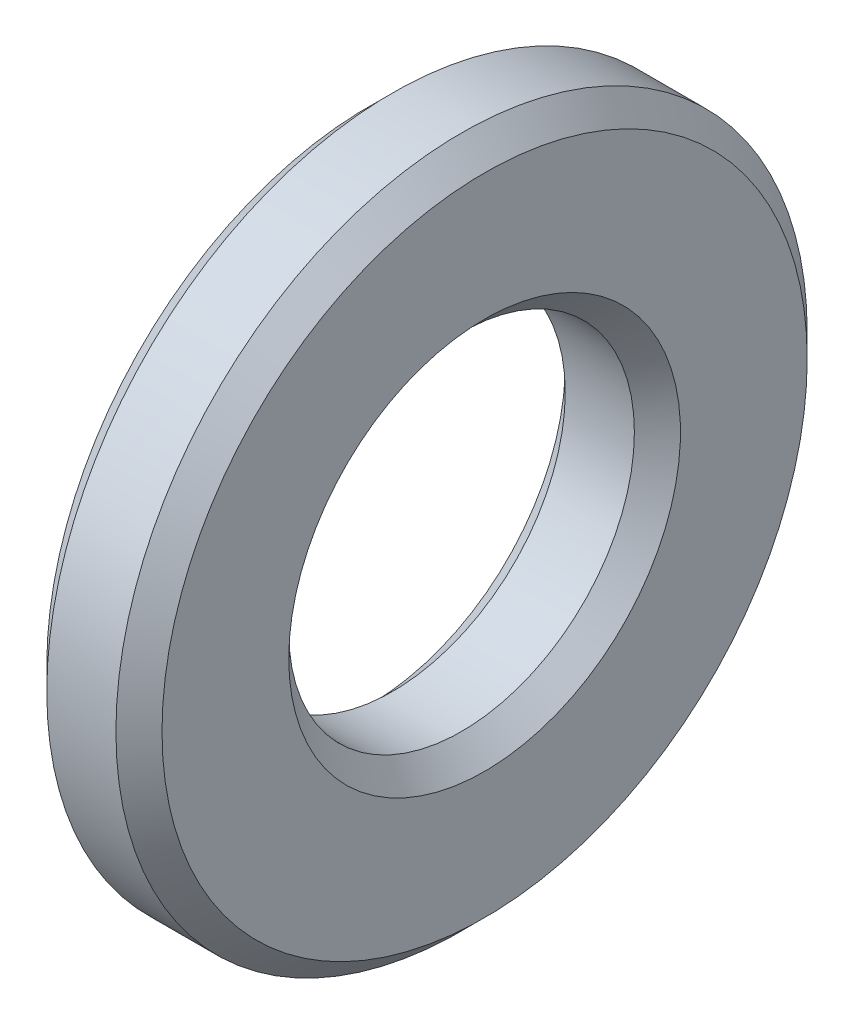
ISO-10303-21;
HEADER;
FILE_DESCRIPTION(('STEP AP214'),'2;1');
FILE_NAME('part.step','',(''),(''),'','','');
FILE_SCHEMA(('AUTOMOTIVE_DESIGN { 1 0 10303 214 1 1 1 1 }'));
ENDSEC;
DATA;
#1=APPLICATION_CONTEXT('core data for automotive mechanical design processes');
#2=APPLICATION_PROTOCOL_DEFINITION('international standard','automotive_design',2000,#1);
#3=PRODUCT_CONTEXT('',#1,'mechanical');
#4=PRODUCT('Part','Part','',(#3));
#5=PRODUCT_RELATED_PRODUCT_CATEGORY('part','',(#4));
#6=PRODUCT_DEFINITION_FORMATION('','',#4);
#7=PRODUCT_DEFINITION_CONTEXT('part definition',#1,'design');
#8=PRODUCT_DEFINITION('design','',#6,#7);
#9=PRODUCT_DEFINITION_SHAPE('','',#8);
#10=(LENGTH_UNIT() NAMED_UNIT(*) SI_UNIT(.MILLI.,.METRE.));
#11=(NAMED_UNIT(*) PLANE_ANGLE_UNIT() SI_UNIT($,.RADIAN.));
#12=(NAMED_UNIT(*) SI_UNIT($,.STERADIAN.) SOLID_ANGLE_UNIT());
#13=UNCERTAINTY_MEASURE_WITH_UNIT(LENGTH_MEASURE(1.E-05),#10,'distance_accuracy_value','');
#14=(GEOMETRIC_REPRESENTATION_CONTEXT(3) GLOBAL_UNCERTAINTY_ASSIGNED_CONTEXT((#13)) GLOBAL_UNIT_ASSIGNED_CONTEXT((#10,
#11,#12)) REPRESENTATION_CONTEXT('',''));
#15=CARTESIAN_POINT('',(0.,0.,0.));
#16=DIRECTION('',(0.,0.,1.));
#17=DIRECTION('',(1.,0.,0.));
#18=AXIS2_PLACEMENT_3D('',#15,#16,#17);
#19=CARTESIAN_POINT('',(0.2,0.,0.));
#20=DIRECTION('',(1.,0.,0.));
#21=DIRECTION('',(0.,0.,-1.));
#22=AXIS2_PLACEMENT_3D('',#19,#20,#21);
#23=CONICAL_SURFACE('',#22,3.,0.785398163397448);
#24=CARTESIAN_POINT('',(0.,0.,0.));
#25=DIRECTION('',(-1.,0.,0.));
#26=DIRECTION('',(0.,0.,1.));
#27=AXIS2_PLACEMENT_3D('',#24,#25,#26);
#28=CIRCLE('',#27,2.8);
#29=CARTESIAN_POINT('',(0.,0.,2.8));
#30=VERTEX_POINT('',#29);
#31=EDGE_CURVE('E10',#30,#30,#28,.T.);
#32=ORIENTED_EDGE('',*,*,#31,.F.);
#33=EDGE_LOOP('',(#32));
#34=FACE_BOUND('',#33,.T.);
#35=CARTESIAN_POINT('',(0.2,0.,0.));
#36=DIRECTION('',(-1.,0.,0.));
#37=DIRECTION('',(0.,0.,1.));
#38=AXIS2_PLACEMENT_3D('',#35,#36,#37);
#39=CIRCLE('',#38,3.);
#40=CARTESIAN_POINT('',(0.2,0.,3.));
#41=VERTEX_POINT('',#40);
#42=EDGE_CURVE('E67',#41,#41,#39,.T.);
#43=ORIENTED_EDGE('',*,*,#42,.T.);
#44=EDGE_LOOP('',(#43));
#45=FACE_BOUND('',#44,.T.);
#46=ADVANCED_FACE('F39',(#34,#45),#23,.T.);
#47=CARTESIAN_POINT('',(0.,2.8,0.));
#48=DIRECTION('',(1.,0.,0.));
#49=DIRECTION('',(0.,0.,-1.));
#50=AXIS2_PLACEMENT_3D('',#47,#48,#49);
#51=PLANE('',#50);
#52=CARTESIAN_POINT('',(0.,0.,0.));
#53=DIRECTION('',(-1.,0.,0.));
#54=DIRECTION('',(0.,0.,1.));
#55=AXIS2_PLACEMENT_3D('',#52,#53,#54);
#56=CIRCLE('',#55,1.7);
#57=CARTESIAN_POINT('',(0.,0.,1.7));
#58=VERTEX_POINT('',#57);
#59=EDGE_CURVE('E45',#58,#58,#56,.T.);
#60=ORIENTED_EDGE('',*,*,#59,.F.);
#61=EDGE_LOOP('',(#60));
#62=FACE_BOUND('',#61,.T.);
#63=ORIENTED_EDGE('',*,*,#31,.T.);
#64=EDGE_LOOP('',(#63));
#65=FACE_BOUND('',#64,.T.);
#66=ADVANCED_FACE('F104',(#62,#65),#51,.F.);
#67=CARTESIAN_POINT('',(0.,0.,0.));
#68=DIRECTION('',(-1.,0.,0.));
#69=DIRECTION('',(0.,0.,1.));
#70=AXIS2_PLACEMENT_3D('',#67,#68,#69);
#71=CONICAL_SURFACE('',#70,1.7,0.785398163397448);
#72=CARTESIAN_POINT('',(0.2,0.,0.));
#73=DIRECTION('',(-1.,0.,0.));
#74=DIRECTION('',(0.,0.,1.));
#75=AXIS2_PLACEMENT_3D('',#72,#73,#74);
#76=CIRCLE('',#75,1.5);
#77=CARTESIAN_POINT('',(0.2,0.,1.5));
#78=VERTEX_POINT('',#77);
#79=EDGE_CURVE('E49',#78,#78,#76,.T.);
#80=ORIENTED_EDGE('',*,*,#79,.F.);
#81=EDGE_LOOP('',(#80));
#82=FACE_BOUND('',#81,.T.);
#83=ORIENTED_EDGE('',*,*,#59,.T.);
#84=EDGE_LOOP('',(#83));
#85=FACE_BOUND('',#84,.T.);
#86=ADVANCED_FACE('F99',(#82,#85),#71,.F.);
#87=CARTESIAN_POINT('',(-0.05,0.,0.));
#88=DIRECTION('',(-1.,0.,0.));
#89=DIRECTION('',(0.,0.,1.));
#90=AXIS2_PLACEMENT_3D('',#87,#88,#89);
#91=CYLINDRICAL_SURFACE('',#90,1.5);
#92=CARTESIAN_POINT('',(0.8,0.,0.));
#93=DIRECTION('',(-1.,0.,0.));
#94=DIRECTION('',(0.,0.,1.));
#95=AXIS2_PLACEMENT_3D('',#92,#93,#94);
#96=CIRCLE('',#95,1.5);
#97=CARTESIAN_POINT('',(0.8,0.,1.5));
#98=VERTEX_POINT('',#97);
#99=EDGE_CURVE('E53',#98,#98,#96,.T.);
#100=ORIENTED_EDGE('',*,*,#99,.F.);
#101=EDGE_LOOP('',(#100));
#102=FACE_BOUND('',#101,.T.);
#103=ORIENTED_EDGE('',*,*,#79,.T.);
#104=EDGE_LOOP('',(#103));
#105=FACE_BOUND('',#104,.T.);
#106=ADVANCED_FACE('F93',(#102,#105),#91,.F.);
#107=CARTESIAN_POINT('',(0.8,0.,0.));
#108=DIRECTION('',(1.,0.,0.));
#109=DIRECTION('',(0.,0.,-1.));
#110=AXIS2_PLACEMENT_3D('',#107,#108,#109);
#111=CONICAL_SURFACE('',#110,1.5,0.785398163397449);
#112=CARTESIAN_POINT('',(1.,0.,0.));
#113=DIRECTION('',(-1.,0.,0.));
#114=DIRECTION('',(0.,0.,1.));
#115=AXIS2_PLACEMENT_3D('',#112,#113,#114);
#116=CIRCLE('',#115,1.7);
#117=CARTESIAN_POINT('',(1.,0.,1.7));
#118=VERTEX_POINT('',#117);
#119=EDGE_CURVE('E58',#118,#118,#116,.T.);
#120=ORIENTED_EDGE('',*,*,#119,.F.);
#121=EDGE_LOOP('',(#120));
#122=FACE_BOUND('',#121,.T.);
#123=ORIENTED_EDGE('',*,*,#99,.T.);
#124=EDGE_LOOP('',(#123));
#125=FACE_BOUND('',#124,.T.);
#126=ADVANCED_FACE('F87',(#122,#125),#111,.F.);
#127=CARTESIAN_POINT('',(1.,2.8,0.));
#128=DIRECTION('',(-1.,0.,0.));
#129=DIRECTION('',(0.,0.,1.));
#130=AXIS2_PLACEMENT_3D('',#127,#128,#129);
#131=PLANE('',#130);
#132=CARTESIAN_POINT('',(1.,0.,0.));
#133=DIRECTION('',(-1.,0.,0.));
#134=DIRECTION('',(0.,0.,1.));
#135=AXIS2_PLACEMENT_3D('',#132,#133,#134);
#136=CIRCLE('',#135,2.8);
#137=CARTESIAN_POINT('',(1.,0.,2.8));
#138=VERTEX_POINT('',#137);
#139=EDGE_CURVE('E61',#138,#138,#136,.T.);
#140=ORIENTED_EDGE('',*,*,#139,.F.);
#141=EDGE_LOOP('',(#140));
#142=FACE_BOUND('',#141,.T.);
#143=ORIENTED_EDGE('',*,*,#119,.T.);
#144=EDGE_LOOP('',(#143));
#145=FACE_BOUND('',#144,.T.);
#146=ADVANCED_FACE('F81',(#142,#145),#131,.F.);
#147=CARTESIAN_POINT('',(1.,0.,0.));
#148=DIRECTION('',(-1.,0.,0.));
#149=DIRECTION('',(0.,0.,1.));
#150=AXIS2_PLACEMENT_3D('',#147,#148,#149);
#151=CONICAL_SURFACE('',#150,2.8,0.785398163397449);
#152=CARTESIAN_POINT('',(0.8,0.,0.));
#153=DIRECTION('',(-1.,0.,0.));
#154=DIRECTION('',(0.,0.,1.));
#155=AXIS2_PLACEMENT_3D('',#152,#153,#154);
#156=CIRCLE('',#155,3.);
#157=CARTESIAN_POINT('',(0.8,0.,3.));
#158=VERTEX_POINT('',#157);
#159=EDGE_CURVE('E64',#158,#158,#156,.T.);
#160=ORIENTED_EDGE('',*,*,#159,.F.);
#161=EDGE_LOOP('',(#160));
#162=FACE_BOUND('',#161,.T.);
#163=ORIENTED_EDGE('',*,*,#139,.T.);
#164=EDGE_LOOP('',(#163));
#165=FACE_BOUND('',#164,.T.);
#166=ADVANCED_FACE('F75',(#162,#165),#151,.T.);
#167=CARTESIAN_POINT('',(-0.05,0.,0.));
#168=DIRECTION('',(-1.,0.,0.));
#169=DIRECTION('',(0.,0.,1.));
#170=AXIS2_PLACEMENT_3D('',#167,#168,#169);
#171=CYLINDRICAL_SURFACE('',#170,3.);
#172=ORIENTED_EDGE('',*,*,#42,.F.);
#173=EDGE_LOOP('',(#172));
#174=FACE_BOUND('',#173,.T.);
#175=ORIENTED_EDGE('',*,*,#159,.T.);
#176=EDGE_LOOP('',(#175));
#177=FACE_BOUND('',#176,.T.);
#178=ADVANCED_FACE('F72',(#174,#177),#171,.T.);
#179=CLOSED_SHELL('',(#46,#66,#86,#106,#126,#146,#166,#178));
#180=MANIFOLD_SOLID_BREP('B2',#179);
#181=ADVANCED_BREP_SHAPE_REPRESENTATION('',(#18,#180),#14);
#182=SHAPE_DEFINITION_REPRESENTATION(#9,#181);
ENDSEC;
END-ISO-10303-21;
